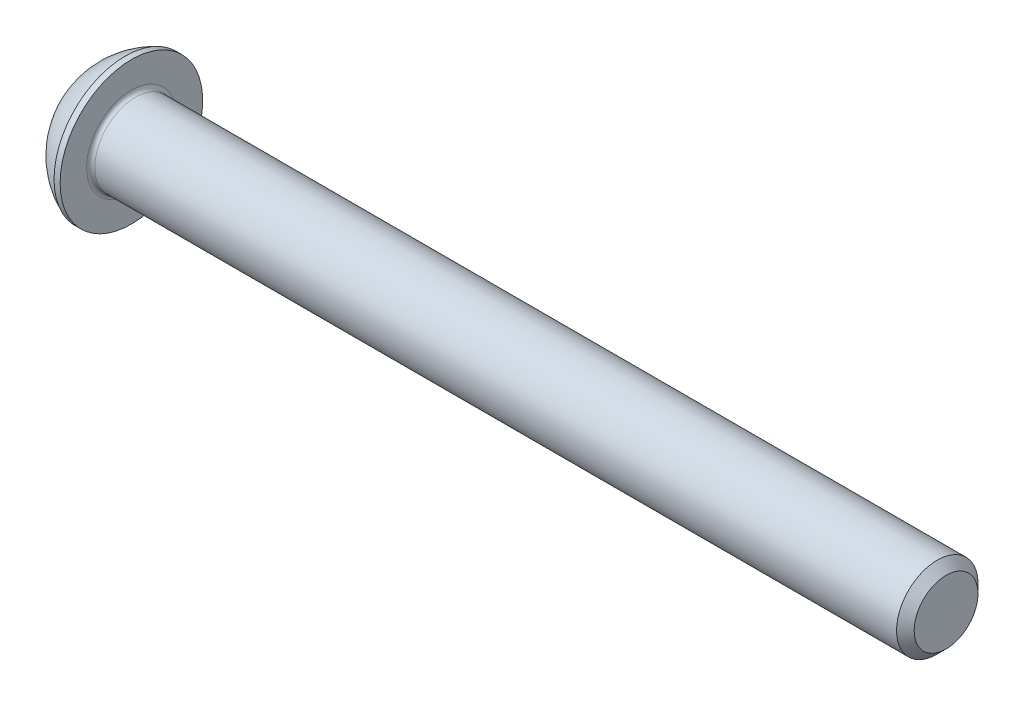
ISO-10303-21;
HEADER;
FILE_DESCRIPTION(('STEP AP214'),'2;1');
FILE_NAME('part.step','',(''),(''),'','','');
FILE_SCHEMA(('AUTOMOTIVE_DESIGN { 1 0 10303 214 1 1 1 1 }'));
ENDSEC;
DATA;
#1=APPLICATION_CONTEXT('core data for automotive mechanical design processes');
#2=APPLICATION_PROTOCOL_DEFINITION('international standard','automotive_design',2000,#1);
#3=PRODUCT_CONTEXT('',#1,'mechanical');
#4=PRODUCT('Part','Part','',(#3));
#5=PRODUCT_RELATED_PRODUCT_CATEGORY('part','',(#4));
#6=PRODUCT_DEFINITION_FORMATION('','',#4);
#7=PRODUCT_DEFINITION_CONTEXT('part definition',#1,'design');
#8=PRODUCT_DEFINITION('design','',#6,#7);
#9=PRODUCT_DEFINITION_SHAPE('','',#8);
#10=(LENGTH_UNIT() NAMED_UNIT(*) SI_UNIT(.MILLI.,.METRE.));
#11=(NAMED_UNIT(*) PLANE_ANGLE_UNIT() SI_UNIT($,.RADIAN.));
#12=(NAMED_UNIT(*) SI_UNIT($,.STERADIAN.) SOLID_ANGLE_UNIT());
#13=UNCERTAINTY_MEASURE_WITH_UNIT(LENGTH_MEASURE(1.E-05),#10,'distance_accuracy_value','');
#14=(GEOMETRIC_REPRESENTATION_CONTEXT(3) GLOBAL_UNCERTAINTY_ASSIGNED_CONTEXT((#13)) GLOBAL_UNIT_ASSIGNED_CONTEXT((#10,
#11,#12)) REPRESENTATION_CONTEXT('',''));
#15=CARTESIAN_POINT('',(0.,0.,0.));
#16=DIRECTION('',(0.,0.,1.));
#17=DIRECTION('',(1.,0.,0.));
#18=AXIS2_PLACEMENT_3D('',#15,#16,#17);
#19=CARTESIAN_POINT('',(0.,0.,0.));
#20=DIRECTION('',(-1.,0.,0.));
#21=DIRECTION('',(0.,0.,1.));
#22=AXIS2_PLACEMENT_3D('',#19,#20,#21);
#23=PLANE('',#22);
#24=CARTESIAN_POINT('',(0.,0.,0.));
#25=DIRECTION('',(-1.,0.,0.));
#26=DIRECTION('',(0.,0.,1.));
#27=AXIS2_PLACEMENT_3D('',#24,#25,#26);
#28=CIRCLE('',#27,0.875);
#29=CARTESIAN_POINT('',(0.,0.875,0.));
#30=VERTEX_POINT('',#29);
#31=EDGE_CURVE('E255',#30,#30,#28,.T.);
#32=ORIENTED_EDGE('',*,*,#31,.T.);
#33=EDGE_LOOP('',(#32));
#34=FACE_BOUND('',#33,.T.);
#35=CARTESIAN_POINT('',(0.,0.,0.));
#36=DIRECTION('',(-1.,0.,0.));
#37=DIRECTION('',(0.,0.,1.));
#38=AXIS2_PLACEMENT_3D('',#35,#36,#37);
#39=CIRCLE('',#38,0.715);
#40=CARTESIAN_POINT('',(0.,-0.71185022254595,0.0670392471711952));
#41=VERTEX_POINT('',#40);
#42=CARTESIAN_POINT('',(0.,-0.413982802373817,0.582960752828799));
#43=VERTEX_POINT('',#42);
#44=EDGE_CURVE('E238',#41,#43,#39,.T.);
#45=ORIENTED_EDGE('',*,*,#44,.F.);
#46=DIRECTION('',(0.,-0.499999999999998,-0.86602540378444));
#47=VECTOR('',#46,1.);
#48=CARTESIAN_POINT('',(0.,-0.750555349946509,0.));
#49=LINE('',#48,#47);
#50=CARTESIAN_POINT('',(0.,-0.750555349946509,0.));
#51=VERTEX_POINT('',#50);
#52=EDGE_CURVE('E436',#41,#51,#49,.T.);
#53=ORIENTED_EDGE('',*,*,#52,.T.);
#54=DIRECTION('',(0.,0.499999999999995,-0.866025403784441));
#55=VECTOR('',#54,1.);
#56=CARTESIAN_POINT('',(0.,-0.375277674973257,-0.65));
#57=LINE('',#56,#55);
#58=CARTESIAN_POINT('',(0.,-0.71185022254595,-0.0670392471711957));
#59=VERTEX_POINT('',#58);
#60=EDGE_CURVE('E188',#51,#59,#57,.T.);
#61=ORIENTED_EDGE('',*,*,#60,.T.);
#62=CARTESIAN_POINT('',(0.,-0.413982802373821,-0.582960752828796));
#63=VERTEX_POINT('',#62);
#64=EDGE_CURVE('E464',#63,#59,#39,.T.);
#65=ORIENTED_EDGE('',*,*,#64,.F.);
#66=CARTESIAN_POINT('',(0.,-0.375277674973257,-0.65));
#67=VERTEX_POINT('',#66);
#68=EDGE_CURVE('E435',#63,#67,#57,.T.);
#69=ORIENTED_EDGE('',*,*,#68,.T.);
#70=DIRECTION('',(0.,1.,0.));
#71=VECTOR('',#70,1.);
#72=CARTESIAN_POINT('',(0.,0.375277674973258,-0.65));
#73=LINE('',#72,#71);
#74=CARTESIAN_POINT('',(0.,-0.297867420172128,-0.65));
#75=VERTEX_POINT('',#74);
#76=EDGE_CURVE('E427',#67,#75,#73,.T.);
#77=ORIENTED_EDGE('',*,*,#76,.T.);
#78=CARTESIAN_POINT('',(0.,0.297867420172128,-0.65));
#79=VERTEX_POINT('',#78);
#80=EDGE_CURVE('E429',#79,#75,#39,.T.);
#81=ORIENTED_EDGE('',*,*,#80,.F.);
#82=CARTESIAN_POINT('',(0.,0.375277674973258,-0.65));
#83=VERTEX_POINT('',#82);
#84=EDGE_CURVE('E420',#79,#83,#73,.T.);
#85=ORIENTED_EDGE('',*,*,#84,.T.);
#86=DIRECTION('',(0.,0.499999999999999,0.866025403784439));
#87=VECTOR('',#86,1.);
#88=CARTESIAN_POINT('',(0.,0.750555349946514,0.));
#89=LINE('',#88,#87);
#90=CARTESIAN_POINT('',(0.,0.413982802373823,-0.582960752828795));
#91=VERTEX_POINT('',#90);
#92=EDGE_CURVE('E422',#83,#91,#89,.T.);
#93=ORIENTED_EDGE('',*,*,#92,.T.);
#94=CARTESIAN_POINT('',(0.,0.711850222545949,-0.0670392471712054));
#95=VERTEX_POINT('',#94);
#96=EDGE_CURVE('E467',#95,#91,#39,.T.);
#97=ORIENTED_EDGE('',*,*,#96,.F.);
#98=CARTESIAN_POINT('',(0.,0.750555349946514,0.));
#99=VERTEX_POINT('',#98);
#100=EDGE_CURVE('E424',#95,#99,#89,.T.);
#101=ORIENTED_EDGE('',*,*,#100,.T.);
#102=DIRECTION('',(0.,-0.500000000000001,0.866025403784438));
#103=VECTOR('',#102,1.);
#104=CARTESIAN_POINT('',(0.,0.375277674973258,0.649999999999998));
#105=LINE('',#104,#103);
#106=CARTESIAN_POINT('',(0.,0.711850222545949,0.0670392471712051));
#107=VERTEX_POINT('',#106);
#108=EDGE_CURVE('E407',#99,#107,#105,.T.);
#109=ORIENTED_EDGE('',*,*,#108,.T.);
#110=CARTESIAN_POINT('',(0.,0.413982802373821,0.582960752828796));
#111=VERTEX_POINT('',#110);
#112=EDGE_CURVE('E237',#111,#107,#39,.T.);
#113=ORIENTED_EDGE('',*,*,#112,.F.);
#114=CARTESIAN_POINT('',(0.,0.375277674973258,0.649999999999998));
#115=VERTEX_POINT('',#114);
#116=EDGE_CURVE('E403',#111,#115,#105,.T.);
#117=ORIENTED_EDGE('',*,*,#116,.T.);
#118=DIRECTION('',(0.,-1.,0.));
#119=VECTOR('',#118,1.);
#120=CARTESIAN_POINT('',(0.,-0.375277674973256,0.649999999999997));
#121=LINE('',#120,#119);
#122=CARTESIAN_POINT('',(0.,0.297867420172133,0.649999999999998));
#123=VERTEX_POINT('',#122);
#124=EDGE_CURVE('E176',#115,#123,#121,.T.);
#125=ORIENTED_EDGE('',*,*,#124,.T.);
#126=CARTESIAN_POINT('',(0.,-0.297867420172135,0.649999999999997));
#127=VERTEX_POINT('',#126);
#128=EDGE_CURVE('E234',#127,#123,#39,.T.);
#129=ORIENTED_EDGE('',*,*,#128,.F.);
#130=CARTESIAN_POINT('',(0.,-0.375277674973256,0.649999999999997));
#131=VERTEX_POINT('',#130);
#132=EDGE_CURVE('E401',#127,#131,#121,.T.);
#133=ORIENTED_EDGE('',*,*,#132,.T.);
#134=EDGE_CURVE('E434',#131,#43,#49,.T.);
#135=ORIENTED_EDGE('',*,*,#134,.T.);
#136=EDGE_LOOP('',(#45,#53,#61,#65,#69,#77,#81,#85,#93,#97,#101,#109,#113,#117,#125,#129,#133,#135));
#137=FACE_BOUND('',#136,.T.);
#138=ADVANCED_FACE('F41',(#34,#137),#23,.T.);
#139=CARTESIAN_POINT('',(0.,0.,0.));
#140=DIRECTION('',(-1.,0.,0.));
#141=DIRECTION('',(0.,0.,1.));
#142=AXIS2_PLACEMENT_3D('',#139,#140,#141);
#143=CYLINDRICAL_SURFACE('',#142,0.715);
#144=CARTESIAN_POINT('',(0.6,0.,0.));
#145=DIRECTION('',(-1.,0.,0.));
#146=DIRECTION('',(0.,0.,1.));
#147=AXIS2_PLACEMENT_3D('',#144,#145,#146);
#148=CIRCLE('',#147,0.715);
#149=CARTESIAN_POINT('',(0.6,-0.71185022254595,0.0670392471711957));
#150=VERTEX_POINT('',#149);
#151=CARTESIAN_POINT('',(0.6,-0.413982802373817,0.582960752828799));
#152=VERTEX_POINT('',#151);
#153=EDGE_CURVE('E460',#150,#152,#148,.T.);
#154=ORIENTED_EDGE('',*,*,#153,.F.);
#155=DIRECTION('',(-1.,0.,0.));
#156=VECTOR('',#155,1.);
#157=CARTESIAN_POINT('',(0.,-0.71185022254595,0.0670392471711949));
#158=LINE('',#157,#156);
#159=EDGE_CURVE('E173',#150,#41,#158,.T.);
#160=ORIENTED_EDGE('',*,*,#159,.T.);
#161=ORIENTED_EDGE('',*,*,#44,.T.);
#162=DIRECTION('',(-1.,0.,0.));
#163=VECTOR('',#162,1.);
#164=CARTESIAN_POINT('',(0.,-0.413982802373817,0.5829607528288));
#165=LINE('',#164,#163);
#166=EDGE_CURVE('E228',#43,#152,#165,.F.);
#167=ORIENTED_EDGE('',*,*,#166,.T.);
#168=EDGE_LOOP('',(#154,#160,#161,#167));
#169=FACE_BOUND('',#168,.T.);
#170=ADVANCED_FACE('F277',(#169),#143,.F.);
#171=CARTESIAN_POINT('',(0.6,-0.413982802373822,-0.582960752828796));
#172=VERTEX_POINT('',#171);
#173=CARTESIAN_POINT('',(0.6,-0.71185022254595,-0.0670392471711961));
#174=VERTEX_POINT('',#173);
#175=EDGE_CURVE('E455',#172,#174,#148,.T.);
#176=ORIENTED_EDGE('',*,*,#175,.F.);
#177=DIRECTION('',(-1.,0.,0.));
#178=VECTOR('',#177,1.);
#179=CARTESIAN_POINT('',(0.,-0.413982802373821,-0.582960752828796));
#180=LINE('',#179,#178);
#181=EDGE_CURVE('E225',#172,#63,#180,.T.);
#182=ORIENTED_EDGE('',*,*,#181,.T.);
#183=ORIENTED_EDGE('',*,*,#64,.T.);
#184=DIRECTION('',(-1.,0.,0.));
#185=VECTOR('',#184,1.);
#186=CARTESIAN_POINT('',(0.,-0.71185022254595,-0.0670392471711957));
#187=LINE('',#186,#185);
#188=EDGE_CURVE('E222',#59,#174,#187,.F.);
#189=ORIENTED_EDGE('',*,*,#188,.T.);
#190=EDGE_LOOP('',(#176,#182,#183,#189));
#191=FACE_BOUND('',#190,.T.);
#192=ADVANCED_FACE('F285',(#191),#143,.F.);
#193=CARTESIAN_POINT('',(0.6,0.297867420172127,-0.650000000000001));
#194=VERTEX_POINT('',#193);
#195=CARTESIAN_POINT('',(0.6,-0.297867420172127,-0.65));
#196=VERTEX_POINT('',#195);
#197=EDGE_CURVE('E453',#194,#196,#148,.T.);
#198=ORIENTED_EDGE('',*,*,#197,.F.);
#199=DIRECTION('',(-1.,0.,0.));
#200=VECTOR('',#199,1.);
#201=CARTESIAN_POINT('',(0.,0.297867420172128,-0.65));
#202=LINE('',#201,#200);
#203=EDGE_CURVE('E218',#194,#79,#202,.T.);
#204=ORIENTED_EDGE('',*,*,#203,.T.);
#205=ORIENTED_EDGE('',*,*,#80,.T.);
#206=DIRECTION('',(-1.,0.,0.));
#207=VECTOR('',#206,1.);
#208=CARTESIAN_POINT('',(0.,-0.297867420172128,-0.65));
#209=LINE('',#208,#207);
#210=EDGE_CURVE('E215',#75,#196,#209,.F.);
#211=ORIENTED_EDGE('',*,*,#210,.T.);
#212=EDGE_LOOP('',(#198,#204,#205,#211));
#213=FACE_BOUND('',#212,.T.);
#214=ADVANCED_FACE('F475',(#213),#143,.F.);
#215=CARTESIAN_POINT('',(0.6,0.711850222545949,-0.0670392471712059));
#216=VERTEX_POINT('',#215);
#217=CARTESIAN_POINT('',(0.6,0.413982802373824,-0.582960752828794));
#218=VERTEX_POINT('',#217);
#219=EDGE_CURVE('E375',#216,#218,#148,.T.);
#220=ORIENTED_EDGE('',*,*,#219,.F.);
#221=DIRECTION('',(-1.,0.,0.));
#222=VECTOR('',#221,1.);
#223=CARTESIAN_POINT('',(0.,0.711850222545949,-0.0670392471712054));
#224=LINE('',#223,#222);
#225=EDGE_CURVE('E212',#216,#95,#224,.T.);
#226=ORIENTED_EDGE('',*,*,#225,.T.);
#227=ORIENTED_EDGE('',*,*,#96,.T.);
#228=DIRECTION('',(-1.,0.,0.));
#229=VECTOR('',#228,1.);
#230=CARTESIAN_POINT('',(0.,0.413982802373823,-0.582960752828795));
#231=LINE('',#230,#229);
#232=EDGE_CURVE('E209',#91,#218,#231,.F.);
#233=ORIENTED_EDGE('',*,*,#232,.T.);
#234=EDGE_LOOP('',(#220,#226,#227,#233));
#235=FACE_BOUND('',#234,.T.);
#236=ADVANCED_FACE('F468',(#235),#143,.F.);
#237=CARTESIAN_POINT('',(0.6,0.413982802373822,0.582960752828796));
#238=VERTEX_POINT('',#237);
#239=CARTESIAN_POINT('',(0.6,0.711850222545949,0.0670392471712056));
#240=VERTEX_POINT('',#239);
#241=EDGE_CURVE('E232',#238,#240,#148,.T.);
#242=ORIENTED_EDGE('',*,*,#241,.F.);
#243=DIRECTION('',(-1.,0.,0.));
#244=VECTOR('',#243,1.);
#245=CARTESIAN_POINT('',(0.,0.413982802373821,0.582960752828796));
#246=LINE('',#245,#244);
#247=EDGE_CURVE('E207',#238,#111,#246,.T.);
#248=ORIENTED_EDGE('',*,*,#247,.T.);
#249=ORIENTED_EDGE('',*,*,#112,.T.);
#250=DIRECTION('',(-1.,0.,0.));
#251=VECTOR('',#250,1.);
#252=CARTESIAN_POINT('',(0.,0.711850222545949,0.0670392471712052));
#253=LINE('',#252,#251);
#254=EDGE_CURVE('E205',#107,#240,#253,.F.);
#255=ORIENTED_EDGE('',*,*,#254,.T.);
#256=EDGE_LOOP('',(#242,#248,#249,#255));
#257=FACE_BOUND('',#256,.T.);
#258=ADVANCED_FACE('F385',(#257),#143,.F.);
#259=CARTESIAN_POINT('',(0.6,-0.297867420172134,0.649999999999997));
#260=VERTEX_POINT('',#259);
#261=CARTESIAN_POINT('',(0.6,0.297867420172133,0.649999999999998));
#262=VERTEX_POINT('',#261);
#263=EDGE_CURVE('E229',#260,#262,#148,.T.);
#264=ORIENTED_EDGE('',*,*,#263,.F.);
#265=DIRECTION('',(-1.,0.,0.));
#266=VECTOR('',#265,1.);
#267=CARTESIAN_POINT('',(0.,-0.297867420172135,0.649999999999997));
#268=LINE('',#267,#266);
#269=EDGE_CURVE('E195',#260,#127,#268,.T.);
#270=ORIENTED_EDGE('',*,*,#269,.T.);
#271=ORIENTED_EDGE('',*,*,#128,.T.);
#272=DIRECTION('',(-1.,0.,0.));
#273=VECTOR('',#272,1.);
#274=CARTESIAN_POINT('',(0.,0.297867420172133,0.649999999999998));
#275=LINE('',#274,#273);
#276=EDGE_CURVE('E191',#123,#262,#275,.F.);
#277=ORIENTED_EDGE('',*,*,#276,.T.);
#278=EDGE_LOOP('',(#264,#270,#271,#277));
#279=FACE_BOUND('',#278,.T.);
#280=ADVANCED_FACE('F284',(#279),#143,.F.);
#281=CARTESIAN_POINT('',(1.68388157894737,0.,0.));
#282=DIRECTION('',(-1.,0.,0.));
#283=DIRECTION('',(0.,1.,0.));
#284=AXIS2_PLACEMENT_3D('',#281,#282,#283);
#285=SPHERICAL_SURFACE('',#284,1.89765175201308);
#286=CARTESIAN_POINT('',(0.95,0.,0.));
#287=DIRECTION('',(-1.,0.,0.));
#288=DIRECTION('',(0.,0.,1.));
#289=AXIS2_PLACEMENT_3D('',#286,#287,#288);
#290=CIRCLE('',#289,1.75);
#291=CARTESIAN_POINT('',(0.95,1.75,0.));
#292=VERTEX_POINT('',#291);
#293=EDGE_CURVE('E248',#292,#292,#290,.T.);
#294=CARTESIAN_POINT('',(0.95,1.75,0.));
#295=CARTESIAN_POINT('',(0.937340169559538,1.74469098940027,0.));
#296=CARTESIAN_POINT('',(0.924737968908448,1.73924455835412,0.));
#297=CARTESIAN_POINT('',(0.899654717595099,1.72807952164054,0.));
#298=CARTESIAN_POINT('',(0.887173666932838,1.7223609159731,0.));
#299=CARTESIAN_POINT('',(0.862338606007229,1.7106541962885,0.));
#300=CARTESIAN_POINT('',(0.849984595743881,1.70466608227132,0.));
#301=CARTESIAN_POINT('',(0.825409430903376,1.69242317344065,0.));
#302=CARTESIAN_POINT('',(0.81318827632622,1.68616837862716,0.));
#303=CARTESIAN_POINT('',(0.788884579669412,1.67339505215556,0.));
#304=CARTESIAN_POINT('',(0.77680203758976,1.66687652049746,0.));
#305=CARTESIAN_POINT('',(0.752781256357558,1.65357879096983,0.));
#306=CARTESIAN_POINT('',(0.740843017205007,1.64679959310029,0.));
#307=CARTESIAN_POINT('',(0.71711646458663,1.63298372389127,0.));
#308=CARTESIAN_POINT('',(0.705328151120803,1.6259470525518,0.));
#309=CARTESIAN_POINT('',(0.681907001944365,1.61161955058688,0.));
#310=CARTESIAN_POINT('',(0.670274166233754,1.60432871996143,0.));
#311=CARTESIAN_POINT('',(0.647169451430108,1.58949633326558,0.));
#312=CARTESIAN_POINT('',(0.635697572337074,1.58195477719518,0.));
#313=CARTESIAN_POINT('',(0.612920173817592,1.56662449155034,0.));
#314=CARTESIAN_POINT('',(0.601614654391145,1.55883576197591,0.));
#315=CARTESIAN_POINT('',(0.579175299902932,1.54301479767485,0.));
#316=CARTESIAN_POINT('',(0.568041464841166,1.53498256294822,0.));
#317=CARTESIAN_POINT('',(0.545950722919735,1.51867837138209,0.));
#318=CARTESIAN_POINT('',(0.534993816060069,1.51040641454259,0.));
#319=CARTESIAN_POINT('',(0.51326209105034,1.49362667469462,0.));
#320=CARTESIAN_POINT('',(0.502487272900276,1.48511889168615,0.));
#321=CARTESIAN_POINT('',(0.481124800056695,1.46787150651415,0.));
#322=CARTESIAN_POINT('',(0.470537145363177,1.45913190435061,0.));
#323=CARTESIAN_POINT('',(0.449553986028991,1.44142499706503,0.));
#324=CARTESIAN_POINT('',(0.439158481388324,1.43245769194298,0.));
#325=CARTESIAN_POINT('',(0.418564518256898,1.41429960218096,0.));
#326=CARTESIAN_POINT('',(0.408366059766139,1.40510881754099,0.));
#327=CARTESIAN_POINT('',(0.388170992226373,1.38650809743857,0.));
#328=CARTESIAN_POINT('',(0.378174383177366,1.37709816197613,0.));
#329=CARTESIAN_POINT('',(0.35838772274546,1.35806357214034,0.));
#330=CARTESIAN_POINT('',(0.348597671362561,1.348438917767,0.));
#331=CARTESIAN_POINT('',(0.32922873720226,1.32897942314977,0.));
#332=CARTESIAN_POINT('',(0.319649854424858,1.31914458290588,0.));
#333=CARTESIAN_POINT('',(0.30070776895829,1.29926934858169,0.));
#334=CARTESIAN_POINT('',(0.291344566269124,1.28922895450139,0.));
#335=CARTESIAN_POINT('',(0.272838250880315,1.26894734135071,0.));
#336=CARTESIAN_POINT('',(0.263695138180673,1.25870612228032,0.));
#337=CARTESIAN_POINT('',(0.245633309013679,1.2380276825808,0.));
#338=CARTESIAN_POINT('',(0.236714592546328,1.22759046195167,0.));
#339=CARTESIAN_POINT('',(0.219105756400304,1.20652493487909,0.));
#340=CARTESIAN_POINT('',(0.21041563672163,1.19589662843564,0.));
#341=CARTESIAN_POINT('',(0.193268087043462,1.17445393547738,0.));
#342=CARTESIAN_POINT('',(0.184810657043969,1.16363954896256,0.));
#343=CARTESIAN_POINT('',(0.168132470025252,1.14182978924308,0.));
#344=CARTESIAN_POINT('',(0.159911713006028,1.13083441603841,0.));
#345=CARTESIAN_POINT('',(0.143710743767988,1.10866786156894,0.));
#346=CARTESIAN_POINT('',(0.135730531549171,1.09749668030414,0.));
#347=CARTESIAN_POINT('',(0.120014410485326,1.07498377112164,0.));
#348=CARTESIAN_POINT('',(0.112278501640297,1.06364204320393,0.));
#349=CARTESIAN_POINT('',(0.0970546306648887,1.04079338254035,0.));
#350=CARTESIAN_POINT('',(0.0895666685345088,1.02928644979447,0.));
#351=CARTESIAN_POINT('',(0.0748422181852083,1.00611279876044,0.));
#352=CARTESIAN_POINT('',(0.0676057299662877,0.994446080472284,0.));
#353=CARTESIAN_POINT('',(0.0533876338292878,0.970958354192094,0.));
#354=CARTESIAN_POINT('',(0.0464060259112086,0.959137346200057,0.));
#355=CARTESIAN_POINT('',(0.0327009855576053,0.935346604180128,0.));
#356=CARTESIAN_POINT('',(0.0259775531220811,0.923376870152236,0.));
#357=CARTESIAN_POINT('',(0.0127920043413564,0.899294327831803,0.));
#358=CARTESIAN_POINT('',(0.00632988799615577,0.887181519539262,0.));
#359=CARTESIAN_POINT('',(0.,0.875,0.));
#360=B_SPLINE_CURVE_WITH_KNOTS('',3,(#294,#295,#296,#297,#298,#299,#300,#301,#302,#303,#304,
#305,#306,#307,#308,#309,#310,#311,#312,#313,#314,#315,#316,#317,#318,#319,#320,#321,#322,#323,
#324,#325,#326,#327,#328,#329,#330,#331,#332,#333,#334,#335,#336,#337,#338,#339,#340,#341,#342,
#343,#344,#345,#346,#347,#348,#349,#350,#351,#352,#353,#354,#355,#356,#357,#358,#359),
.UNSPECIFIED.,.F.,.F.,(4,2,2,2,2,2,2,2,2,2,2,2,2,2,2,2,2,2,2,2,2,2,2,2,2,2,2,2,2,2,2,2,4),(0.,
0.0411830717721068,0.0823661435442138,0.12354921531632,0.164732287088427,0.205915358860534,
0.247098430632641,0.288281502404748,0.329464574176855,0.370647645948962,0.411830717721068,
0.453013789493175,0.494196861265282,0.535379933037389,0.576563004809496,0.617746076581603,
0.658929148353709,0.700112220125816,0.741295291897923,0.78247836367003,0.823661435442137,
0.864844507214244,0.906027578986351,0.947210650758457,0.988393722530564,1.02957679430267,
1.07075986607478,1.11194293784688,1.15312600961899,1.1943090813911,1.23549215316321,
1.27667522493531,1.31785829670742),.UNSPECIFIED.);
#361=EDGE_CURVE('BSEAM290',#292,#30,#360,.T.);
#362=ORIENTED_EDGE('',*,*,#293,.T.);
#363=ORIENTED_EDGE('',*,*,#31,.F.);
#364=ORIENTED_EDGE('',*,*,#361,.T.);
#365=ORIENTED_EDGE('',*,*,#361,.F.);
#366=EDGE_LOOP('',(#362,#364,#363,#365));
#367=FACE_BOUND('',#366,.T.);
#368=ADVANCED_FACE('F290',(#367),#285,.T.);
#369=CARTESIAN_POINT('',(0.,0.,0.));
#370=DIRECTION('',(-1.,0.,0.));
#371=DIRECTION('',(0.,0.,1.));
#372=AXIS2_PLACEMENT_3D('',#369,#370,#371);
#373=CYLINDRICAL_SURFACE('',#372,1.75);
#374=ORIENTED_EDGE('',*,*,#293,.F.);
#375=EDGE_LOOP('',(#374));
#376=FACE_BOUND('',#375,.T.);
#377=CARTESIAN_POINT('',(1.1,0.,0.));
#378=DIRECTION('',(-1.,0.,0.));
#379=DIRECTION('',(0.,0.,1.));
#380=AXIS2_PLACEMENT_3D('',#377,#378,#379);
#381=CIRCLE('',#380,1.75);
#382=CARTESIAN_POINT('',(1.1,0.,1.75));
#383=VERTEX_POINT('',#382);
#384=EDGE_CURVE('E246',#383,#383,#381,.T.);
#385=ORIENTED_EDGE('',*,*,#384,.T.);
#386=EDGE_LOOP('',(#385));
#387=FACE_BOUND('',#386,.T.);
#388=ADVANCED_FACE('F293',(#376,#387),#373,.T.);
#389=CARTESIAN_POINT('',(1.1,0.999999999999992,0.));
#390=DIRECTION('',(-1.,0.,0.));
#391=DIRECTION('',(0.,0.,1.));
#392=AXIS2_PLACEMENT_3D('',#389,#390,#391);
#393=PLANE('',#392);
#394=CARTESIAN_POINT('',(1.1,0.,0.));
#395=DIRECTION('',(-1.,0.,0.));
#396=DIRECTION('',(0.,0.,1.));
#397=AXIS2_PLACEMENT_3D('',#394,#395,#396);
#398=CIRCLE('',#397,1.09999999999999);
#399=CARTESIAN_POINT('',(1.1,0.,1.09999999999999));
#400=VERTEX_POINT('',#399);
#401=EDGE_CURVE('E47',#400,#400,#398,.T.);
#402=ORIENTED_EDGE('',*,*,#401,.T.);
#403=EDGE_LOOP('',(#402));
#404=FACE_BOUND('',#403,.T.);
#405=ORIENTED_EDGE('',*,*,#384,.F.);
#406=EDGE_LOOP('',(#405));
#407=FACE_BOUND('',#406,.T.);
#408=ADVANCED_FACE('F257',(#404,#407),#393,.F.);
#409=CARTESIAN_POINT('',(0.,0.,0.));
#410=DIRECTION('',(-1.,0.,0.));
#411=DIRECTION('',(0.,0.,1.));
#412=AXIS2_PLACEMENT_3D('',#409,#410,#411);
#413=CYLINDRICAL_SURFACE('',#412,0.999999999999993);
#414=CARTESIAN_POINT('',(1.2,0.,0.));
#415=DIRECTION('',(-1.,0.,0.));
#416=DIRECTION('',(0.,0.,1.));
#417=AXIS2_PLACEMENT_3D('',#414,#415,#416);
#418=CIRCLE('',#417,0.999999999999993);
#419=CARTESIAN_POINT('',(1.2,0.,0.999999999999993));
#420=VERTEX_POINT('',#419);
#421=EDGE_CURVE('E11',#420,#420,#418,.F.);
#422=ORIENTED_EDGE('',*,*,#421,.T.);
#423=EDGE_LOOP('',(#422));
#424=FACE_BOUND('',#423,.T.);
#425=CARTESIAN_POINT('',(20.8835,0.,0.));
#426=DIRECTION('',(-1.,0.,0.));
#427=DIRECTION('',(0.,0.,1.));
#428=AXIS2_PLACEMENT_3D('',#425,#426,#427);
#429=CIRCLE('',#428,0.999999999999994);
#430=CARTESIAN_POINT('',(20.8835,0.,0.999999999999994));
#431=VERTEX_POINT('',#430);
#432=EDGE_CURVE('E243',#431,#431,#429,.T.);
#433=ORIENTED_EDGE('',*,*,#432,.T.);
#434=EDGE_LOOP('',(#433));
#435=FACE_BOUND('',#434,.T.);
#436=ADVANCED_FACE('F296',(#424,#435),#413,.T.);
#437=CARTESIAN_POINT('',(21.1,0.,0.));
#438=DIRECTION('',(-1.,0.,0.));
#439=DIRECTION('',(0.,0.,1.));
#440=AXIS2_PLACEMENT_3D('',#437,#438,#439);
#441=CONICAL_SURFACE('',#440,0.7835,0.785398163397462);
#442=ORIENTED_EDGE('',*,*,#432,.F.);
#443=EDGE_LOOP('',(#442));
#444=FACE_BOUND('',#443,.T.);
#445=CARTESIAN_POINT('',(21.1,0.,0.));
#446=DIRECTION('',(-1.,0.,0.));
#447=DIRECTION('',(0.,0.,1.));
#448=AXIS2_PLACEMENT_3D('',#445,#446,#447);
#449=CIRCLE('',#448,0.7835);
#450=CARTESIAN_POINT('',(21.1,0.,0.7835));
#451=VERTEX_POINT('',#450);
#452=EDGE_CURVE('E239',#451,#451,#449,.T.);
#453=ORIENTED_EDGE('',*,*,#452,.T.);
#454=EDGE_LOOP('',(#453));
#455=FACE_BOUND('',#454,.T.);
#456=ADVANCED_FACE('F271',(#444,#455),#441,.T.);
#457=CARTESIAN_POINT('',(21.1,0.,0.));
#458=DIRECTION('',(-1.,0.,0.));
#459=DIRECTION('',(0.,0.,1.));
#460=AXIS2_PLACEMENT_3D('',#457,#458,#459);
#461=PLANE('',#460);
#462=ORIENTED_EDGE('',*,*,#452,.F.);
#463=EDGE_LOOP('',(#462));
#464=FACE_BOUND('',#463,.T.);
#465=ADVANCED_FACE('F265',(#464),#461,.F.);
#466=CARTESIAN_POINT('',(1.2,0.,0.));
#467=DIRECTION('',(-1.,0.,0.));
#468=DIRECTION('',(0.,0.,1.));
#469=AXIS2_PLACEMENT_3D('',#466,#467,#468);
#470=TOROIDAL_SURFACE('',#469,1.09999999999999,0.1);
#471=ORIENTED_EDGE('',*,*,#421,.F.);
#472=EDGE_LOOP('',(#471));
#473=FACE_BOUND('',#472,.T.);
#474=ORIENTED_EDGE('',*,*,#401,.F.);
#475=EDGE_LOOP('',(#474));
#476=FACE_BOUND('',#475,.T.);
#477=ADVANCED_FACE('F43',(#473,#476),#470,.F.);
#478=CARTESIAN_POINT('',(1.01280544247059,0.,0.));
#479=DIRECTION('',(-1.,0.,0.));
#480=DIRECTION('',(0.,0.,1.));
#481=AXIS2_PLACEMENT_3D('',#478,#479,#480);
#482=CONICAL_SURFACE('',#481,0.,1.04719755119659);
#483=EDGE_CURVE('E233',#262,#238,#148,.T.);
#484=ORIENTED_EDGE('',*,*,#483,.T.);
#485=ORIENTED_EDGE('',*,*,#241,.T.);
#486=EDGE_CURVE('E362',#240,#216,#148,.T.);
#487=ORIENTED_EDGE('',*,*,#486,.T.);
#488=ORIENTED_EDGE('',*,*,#219,.T.);
#489=EDGE_CURVE('E456',#218,#194,#148,.T.);
#490=ORIENTED_EDGE('',*,*,#489,.T.);
#491=ORIENTED_EDGE('',*,*,#197,.T.);
#492=EDGE_CURVE('E451',#196,#172,#148,.T.);
#493=ORIENTED_EDGE('',*,*,#492,.T.);
#494=ORIENTED_EDGE('',*,*,#175,.T.);
#495=EDGE_CURVE('E185',#174,#150,#148,.T.);
#496=ORIENTED_EDGE('',*,*,#495,.T.);
#497=ORIENTED_EDGE('',*,*,#153,.T.);
#498=EDGE_CURVE('E457',#152,#260,#148,.T.);
#499=ORIENTED_EDGE('',*,*,#498,.T.);
#500=ORIENTED_EDGE('',*,*,#263,.T.);
#501=EDGE_LOOP('',(#484,#485,#487,#488,#490,#491,#493,#494,#496,#497,#499,#500));
#502=FACE_BOUND('',#501,.T.);
#503=CARTESIAN_POINT('',(1.01280544247059,0.,0.));
#504=VERTEX_POINT('',#503);
#505=VERTEX_LOOP('',#504);
#506=FACE_BOUND('',#505,.T.);
#507=ADVANCED_FACE('F261',(#502,#506),#482,.F.);
#508=CARTESIAN_POINT('',(0.6,-1.12583302491976,-0.65));
#509=DIRECTION('',(1.,0.,0.));
#510=DIRECTION('',(0.,0.,-1.));
#511=AXIS2_PLACEMENT_3D('',#508,#509,#510);
#512=PLANE('',#511);
#513=ORIENTED_EDGE('',*,*,#492,.F.);
#514=DIRECTION('',(0.,1.,0.));
#515=VECTOR('',#514,1.);
#516=CARTESIAN_POINT('',(0.6,0.375277674973258,-0.65));
#517=LINE('',#516,#515);
#518=CARTESIAN_POINT('',(0.6,-0.375277674973257,-0.65));
#519=VERTEX_POINT('',#518);
#520=EDGE_CURVE('E439',#519,#196,#517,.T.);
#521=ORIENTED_EDGE('',*,*,#520,.F.);
#522=DIRECTION('',(0.,0.499999999999995,-0.866025403784441));
#523=VECTOR('',#522,1.);
#524=CARTESIAN_POINT('',(0.6,-0.375277674973257,-0.65));
#525=LINE('',#524,#523);
#526=EDGE_CURVE('E187',#172,#519,#525,.T.);
#527=ORIENTED_EDGE('',*,*,#526,.F.);
#528=EDGE_LOOP('',(#513,#521,#527));
#529=FACE_BOUND('',#528,.T.);
#530=ADVANCED_FACE('F266',(#529),#512,.F.);
#531=CARTESIAN_POINT('',(0.6,0.375277674973258,-0.65));
#532=DIRECTION('',(0.,0.,1.));
#533=DIRECTION('',(1.,0.,0.));
#534=AXIS2_PLACEMENT_3D('',#531,#532,#533);
#535=PLANE('',#534);
#536=ORIENTED_EDGE('',*,*,#76,.F.);
#537=DIRECTION('',(-1.,0.,0.));
#538=VECTOR('',#537,1.);
#539=CARTESIAN_POINT('',(0.6,-0.375277674973257,-0.65));
#540=LINE('',#539,#538);
#541=EDGE_CURVE('E192',#519,#67,#540,.T.);
#542=ORIENTED_EDGE('',*,*,#541,.F.);
#543=ORIENTED_EDGE('',*,*,#520,.T.);
#544=ORIENTED_EDGE('',*,*,#210,.F.);
#545=EDGE_LOOP('',(#536,#542,#543,#544));
#546=FACE_BOUND('',#545,.T.);
#547=ADVANCED_FACE('F313',(#546),#535,.T.);
#548=CARTESIAN_POINT('',(0.6,-0.375277674973257,-0.65));
#549=DIRECTION('',(0.,0.866025403784441,0.499999999999995));
#550=DIRECTION('',(0.,-0.499999999999995,0.866025403784441));
#551=AXIS2_PLACEMENT_3D('',#548,#549,#550);
#552=PLANE('',#551);
#553=ORIENTED_EDGE('',*,*,#526,.T.);
#554=ORIENTED_EDGE('',*,*,#541,.T.);
#555=ORIENTED_EDGE('',*,*,#68,.F.);
#556=ORIENTED_EDGE('',*,*,#181,.F.);
#557=EDGE_LOOP('',(#553,#554,#555,#556));
#558=FACE_BOUND('',#557,.T.);
#559=ADVANCED_FACE('F312',(#558),#552,.T.);
#560=ORIENTED_EDGE('',*,*,#495,.F.);
#561=CARTESIAN_POINT('',(0.6,-0.750555349946509,0.));
#562=VERTEX_POINT('',#561);
#563=EDGE_CURVE('E177',#562,#174,#525,.T.);
#564=ORIENTED_EDGE('',*,*,#563,.F.);
#565=DIRECTION('',(0.,-0.499999999999998,-0.86602540378444));
#566=VECTOR('',#565,1.);
#567=CARTESIAN_POINT('',(0.6,-0.750555349946509,0.));
#568=LINE('',#567,#566);
#569=EDGE_CURVE('E63',#150,#562,#568,.T.);
#570=ORIENTED_EDGE('',*,*,#569,.F.);
#571=EDGE_LOOP('',(#560,#564,#570));
#572=FACE_BOUND('',#571,.T.);
#573=ADVANCED_FACE('F179',(#572),#512,.F.);
#574=ORIENTED_EDGE('',*,*,#60,.F.);
#575=DIRECTION('',(-1.,0.,0.));
#576=VECTOR('',#575,1.);
#577=CARTESIAN_POINT('',(0.6,-0.750555349946509,0.));
#578=LINE('',#577,#576);
#579=EDGE_CURVE('E167',#562,#51,#578,.T.);
#580=ORIENTED_EDGE('',*,*,#579,.F.);
#581=ORIENTED_EDGE('',*,*,#563,.T.);
#582=ORIENTED_EDGE('',*,*,#188,.F.);
#583=EDGE_LOOP('',(#574,#580,#581,#582));
#584=FACE_BOUND('',#583,.T.);
#585=ADVANCED_FACE('F189',(#584),#552,.T.);
#586=CARTESIAN_POINT('',(0.6,-0.750555349946509,0.));
#587=DIRECTION('',(0.,0.86602540378444,-0.499999999999998));
#588=DIRECTION('',(0.,0.499999999999998,0.86602540378444));
#589=AXIS2_PLACEMENT_3D('',#586,#587,#588);
#590=PLANE('',#589);
#591=ORIENTED_EDGE('',*,*,#569,.T.);
#592=ORIENTED_EDGE('',*,*,#579,.T.);
#593=ORIENTED_EDGE('',*,*,#52,.F.);
#594=ORIENTED_EDGE('',*,*,#159,.F.);
#595=EDGE_LOOP('',(#591,#592,#593,#594));
#596=FACE_BOUND('',#595,.T.);
#597=ADVANCED_FACE('F166',(#596),#590,.T.);
#598=ORIENTED_EDGE('',*,*,#498,.F.);
#599=CARTESIAN_POINT('',(0.6,-0.375277674973256,0.649999999999997));
#600=VERTEX_POINT('',#599);
#601=EDGE_CURVE('E174',#600,#152,#568,.T.);
#602=ORIENTED_EDGE('',*,*,#601,.F.);
#603=DIRECTION('',(0.,-1.,0.));
#604=VECTOR('',#603,1.);
#605=CARTESIAN_POINT('',(0.6,-0.375277674973256,0.649999999999997));
#606=LINE('',#605,#604);
#607=EDGE_CURVE('E57',#260,#600,#606,.T.);
#608=ORIENTED_EDGE('',*,*,#607,.F.);
#609=EDGE_LOOP('',(#598,#602,#608));
#610=FACE_BOUND('',#609,.T.);
#611=ADVANCED_FACE('F342',(#610),#512,.F.);
#612=CARTESIAN_POINT('',(0.6,-0.375277674973256,0.649999999999997));
#613=DIRECTION('',(0.,0.,-1.));
#614=DIRECTION('',(0.,1.,0.));
#615=AXIS2_PLACEMENT_3D('',#612,#613,#614);
#616=PLANE('',#615);
#617=ORIENTED_EDGE('',*,*,#607,.T.);
#618=DIRECTION('',(-1.,0.,0.));
#619=VECTOR('',#618,1.);
#620=CARTESIAN_POINT('',(0.6,-0.375277674973256,0.649999999999997));
#621=LINE('',#620,#619);
#622=EDGE_CURVE('E397',#600,#131,#621,.T.);
#623=ORIENTED_EDGE('',*,*,#622,.T.);
#624=ORIENTED_EDGE('',*,*,#132,.F.);
#625=ORIENTED_EDGE('',*,*,#269,.F.);
#626=EDGE_LOOP('',(#617,#623,#624,#625));
#627=FACE_BOUND('',#626,.T.);
#628=ADVANCED_FACE('F307',(#627),#616,.T.);
#629=ORIENTED_EDGE('',*,*,#134,.F.);
#630=ORIENTED_EDGE('',*,*,#622,.F.);
#631=ORIENTED_EDGE('',*,*,#601,.T.);
#632=ORIENTED_EDGE('',*,*,#166,.F.);
#633=EDGE_LOOP('',(#629,#630,#631,#632));
#634=FACE_BOUND('',#633,.T.);
#635=ADVANCED_FACE('F304',(#634),#590,.T.);
#636=ORIENTED_EDGE('',*,*,#483,.F.);
#637=CARTESIAN_POINT('',(0.6,0.375277674973258,0.649999999999998));
#638=VERTEX_POINT('',#637);
#639=EDGE_CURVE('E390',#638,#262,#606,.T.);
#640=ORIENTED_EDGE('',*,*,#639,.F.);
#641=DIRECTION('',(0.,-0.500000000000001,0.866025403784438));
#642=VECTOR('',#641,1.);
#643=CARTESIAN_POINT('',(0.6,0.375277674973258,0.649999999999998));
#644=LINE('',#643,#642);
#645=EDGE_CURVE('E380',#238,#638,#644,.T.);
#646=ORIENTED_EDGE('',*,*,#645,.F.);
#647=EDGE_LOOP('',(#636,#640,#646));
#648=FACE_BOUND('',#647,.T.);
#649=ADVANCED_FACE('F308',(#648),#512,.F.);
#650=ORIENTED_EDGE('',*,*,#124,.F.);
#651=DIRECTION('',(-1.,0.,0.));
#652=VECTOR('',#651,1.);
#653=CARTESIAN_POINT('',(0.6,0.375277674973258,0.649999999999998));
#654=LINE('',#653,#652);
#655=EDGE_CURVE('E394',#638,#115,#654,.T.);
#656=ORIENTED_EDGE('',*,*,#655,.F.);
#657=ORIENTED_EDGE('',*,*,#639,.T.);
#658=ORIENTED_EDGE('',*,*,#276,.F.);
#659=EDGE_LOOP('',(#650,#656,#657,#658));
#660=FACE_BOUND('',#659,.T.);
#661=ADVANCED_FACE('F332',(#660),#616,.T.);
#662=CARTESIAN_POINT('',(0.6,0.375277674973258,0.649999999999998));
#663=DIRECTION('',(0.,-0.866025403784438,-0.500000000000001));
#664=DIRECTION('',(0.,0.500000000000001,-0.866025403784438));
#665=AXIS2_PLACEMENT_3D('',#662,#663,#664);
#666=PLANE('',#665);
#667=ORIENTED_EDGE('',*,*,#645,.T.);
#668=ORIENTED_EDGE('',*,*,#655,.T.);
#669=ORIENTED_EDGE('',*,*,#116,.F.);
#670=ORIENTED_EDGE('',*,*,#247,.F.);
#671=EDGE_LOOP('',(#667,#668,#669,#670));
#672=FACE_BOUND('',#671,.T.);
#673=ADVANCED_FACE('F329',(#672),#666,.T.);
#674=ORIENTED_EDGE('',*,*,#486,.F.);
#675=CARTESIAN_POINT('',(0.6,0.750555349946514,0.));
#676=VERTEX_POINT('',#675);
#677=EDGE_CURVE('E370',#676,#240,#644,.T.);
#678=ORIENTED_EDGE('',*,*,#677,.F.);
#679=DIRECTION('',(0.,0.499999999999999,0.866025403784439));
#680=VECTOR('',#679,1.);
#681=CARTESIAN_POINT('',(0.6,0.750555349946514,0.));
#682=LINE('',#681,#680);
#683=EDGE_CURVE('E368',#216,#676,#682,.T.);
#684=ORIENTED_EDGE('',*,*,#683,.F.);
#685=EDGE_LOOP('',(#674,#678,#684));
#686=FACE_BOUND('',#685,.T.);
#687=ADVANCED_FACE('F328',(#686),#512,.F.);
#688=ORIENTED_EDGE('',*,*,#108,.F.);
#689=DIRECTION('',(-1.,0.,0.));
#690=VECTOR('',#689,1.);
#691=CARTESIAN_POINT('',(0.6,0.750555349946514,0.));
#692=LINE('',#691,#690);
#693=EDGE_CURVE('E376',#676,#99,#692,.T.);
#694=ORIENTED_EDGE('',*,*,#693,.F.);
#695=ORIENTED_EDGE('',*,*,#677,.T.);
#696=ORIENTED_EDGE('',*,*,#254,.F.);
#697=EDGE_LOOP('',(#688,#694,#695,#696));
#698=FACE_BOUND('',#697,.T.);
#699=ADVANCED_FACE('F325',(#698),#666,.T.);
#700=CARTESIAN_POINT('',(0.6,0.750555349946514,0.));
#701=DIRECTION('',(0.,-0.866025403784439,0.499999999999999));
#702=DIRECTION('',(0.,-0.499999999999999,-0.866025403784439));
#703=AXIS2_PLACEMENT_3D('',#700,#701,#702);
#704=PLANE('',#703);
#705=ORIENTED_EDGE('',*,*,#683,.T.);
#706=ORIENTED_EDGE('',*,*,#693,.T.);
#707=ORIENTED_EDGE('',*,*,#100,.F.);
#708=ORIENTED_EDGE('',*,*,#225,.F.);
#709=EDGE_LOOP('',(#705,#706,#707,#708));
#710=FACE_BOUND('',#709,.T.);
#711=ADVANCED_FACE('F323',(#710),#704,.T.);
#712=CARTESIAN_POINT('',(0.6,0.375277674973258,-0.65));
#713=VERTEX_POINT('',#712);
#714=EDGE_CURVE('E184',#194,#713,#517,.T.);
#715=ORIENTED_EDGE('',*,*,#714,.T.);
#716=DIRECTION('',(-1.,0.,0.));
#717=VECTOR('',#716,1.);
#718=CARTESIAN_POINT('',(0.6,0.375277674973258,-0.65));
#719=LINE('',#718,#717);
#720=EDGE_CURVE('E200',#713,#83,#719,.T.);
#721=ORIENTED_EDGE('',*,*,#720,.T.);
#722=ORIENTED_EDGE('',*,*,#84,.F.);
#723=ORIENTED_EDGE('',*,*,#203,.F.);
#724=EDGE_LOOP('',(#715,#721,#722,#723));
#725=FACE_BOUND('',#724,.T.);
#726=ADVANCED_FACE('F319',(#725),#535,.T.);
#727=ORIENTED_EDGE('',*,*,#489,.F.);
#728=EDGE_CURVE('E438',#713,#218,#682,.T.);
#729=ORIENTED_EDGE('',*,*,#728,.F.);
#730=ORIENTED_EDGE('',*,*,#714,.F.);
#731=EDGE_LOOP('',(#727,#729,#730));
#732=FACE_BOUND('',#731,.T.);
#733=ADVANCED_FACE('F322',(#732),#512,.F.);
#734=ORIENTED_EDGE('',*,*,#92,.F.);
#735=ORIENTED_EDGE('',*,*,#720,.F.);
#736=ORIENTED_EDGE('',*,*,#728,.T.);
#737=ORIENTED_EDGE('',*,*,#232,.F.);
#738=EDGE_LOOP('',(#734,#735,#736,#737));
#739=FACE_BOUND('',#738,.T.);
#740=ADVANCED_FACE('F316',(#739),#704,.T.);
#741=CLOSED_SHELL('',(#138,#170,#192,#214,#236,#258,#280,#368,#388,#408,#436,#456,#465,#477,
#507,#530,#547,#559,#573,#585,#597,#611,#628,#635,#649,#661,#673,#687,#699,#711,#726,#733,#740));
#742=MANIFOLD_SOLID_BREP('B2',#741);
#743=ADVANCED_BREP_SHAPE_REPRESENTATION('',(#18,#742),#14);
#744=SHAPE_DEFINITION_REPRESENTATION(#9,#743);
ENDSEC;
END-ISO-10303-21;
